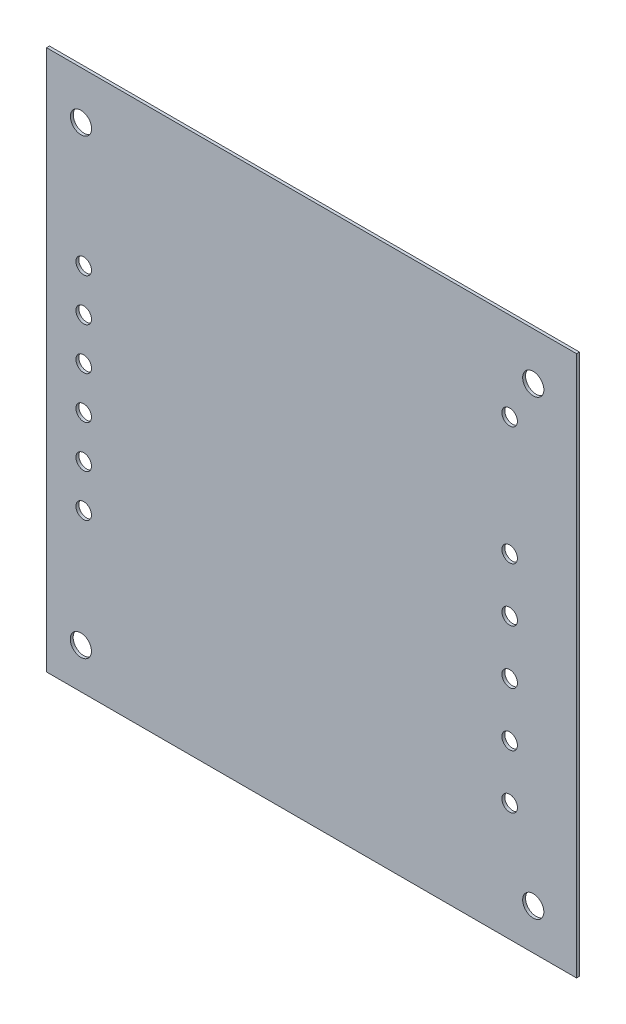
ISO-10303-21;
HEADER;
FILE_DESCRIPTION(('STEP AP214'),'2;1');
FILE_NAME('part.step','',(''),(''),'','','');
FILE_SCHEMA(('AUTOMOTIVE_DESIGN { 1 0 10303 214 1 1 1 1 }'));
ENDSEC;
DATA;
#1=APPLICATION_CONTEXT('core data for automotive mechanical design processes');
#2=APPLICATION_PROTOCOL_DEFINITION('international standard','automotive_design',2000,#1);
#3=PRODUCT_CONTEXT('',#1,'mechanical');
#4=PRODUCT('Part','Part','',(#3));
#5=PRODUCT_RELATED_PRODUCT_CATEGORY('part','',(#4));
#6=PRODUCT_DEFINITION_FORMATION('','',#4);
#7=PRODUCT_DEFINITION_CONTEXT('part definition',#1,'design');
#8=PRODUCT_DEFINITION('design','',#6,#7);
#9=PRODUCT_DEFINITION_SHAPE('','',#8);
#10=(LENGTH_UNIT() NAMED_UNIT(*) SI_UNIT(.MILLI.,.METRE.));
#11=(NAMED_UNIT(*) PLANE_ANGLE_UNIT() SI_UNIT($,.RADIAN.));
#12=(NAMED_UNIT(*) SI_UNIT($,.STERADIAN.) SOLID_ANGLE_UNIT());
#13=UNCERTAINTY_MEASURE_WITH_UNIT(LENGTH_MEASURE(1.E-05),#10,'distance_accuracy_value','');
#14=(GEOMETRIC_REPRESENTATION_CONTEXT(3) GLOBAL_UNCERTAINTY_ASSIGNED_CONTEXT((#13)) GLOBAL_UNIT_ASSIGNED_CONTEXT((#10,
#11,#12)) REPRESENTATION_CONTEXT('',''));
#15=CARTESIAN_POINT('',(0.,0.,0.));
#16=DIRECTION('',(0.,0.,1.));
#17=DIRECTION('',(1.,0.,0.));
#18=AXIS2_PLACEMENT_3D('',#15,#16,#17);
#19=CARTESIAN_POINT('',(37.62699945271,38.375001892447,0.));
#20=DIRECTION('',(0.,0.,-1.));
#21=DIRECTION('',(0.,-1.,0.));
#22=AXIS2_PLACEMENT_3D('',#19,#20,#21);
#23=PLANE('',#22);
#24=CARTESIAN_POINT('',(69.,69.892997741699,0.));
#25=DIRECTION('',(0.,0.,1.));
#26=DIRECTION('',(1.,0.,0.));
#27=AXIS2_PLACEMENT_3D('',#24,#25,#26);
#28=CIRCLE('',#27,1.5);
#29=CARTESIAN_POINT('',(70.5,69.892997741699,0.));
#30=VERTEX_POINT('',#29);
#31=EDGE_CURVE('E27',#30,#30,#28,.T.);
#32=ORIENTED_EDGE('',*,*,#31,.F.);
#33=EDGE_LOOP('',(#32));
#34=FACE_BOUND('',#33,.T.);
#35=CARTESIAN_POINT('',(65.663,64.143,0.));
#36=DIRECTION('',(0.,0.,1.));
#37=DIRECTION('',(1.,0.,0.));
#38=AXIS2_PLACEMENT_3D('',#35,#36,#37);
#39=CIRCLE('',#38,1.1);
#40=CARTESIAN_POINT('',(66.763,64.143,0.));
#41=VERTEX_POINT('',#40);
#42=EDGE_CURVE('E259',#41,#41,#39,.T.);
#43=ORIENTED_EDGE('',*,*,#42,.F.);
#44=EDGE_LOOP('',(#43));
#45=FACE_BOUND('',#44,.T.);
#46=CARTESIAN_POINT('',(65.663,47.36,0.));
#47=DIRECTION('',(0.,0.,1.));
#48=DIRECTION('',(1.,0.,0.));
#49=AXIS2_PLACEMENT_3D('',#46,#47,#48);
#50=CIRCLE('',#49,1.1);
#51=CARTESIAN_POINT('',(66.763,47.36,0.));
#52=VERTEX_POINT('',#51);
#53=EDGE_CURVE('E268',#52,#52,#50,.T.);
#54=ORIENTED_EDGE('',*,*,#53,.F.);
#55=EDGE_LOOP('',(#54));
#56=FACE_BOUND('',#55,.T.);
#57=CARTESIAN_POINT('',(65.663,39.722,0.));
#58=DIRECTION('',(0.,0.,1.));
#59=DIRECTION('',(1.,0.,0.));
#60=AXIS2_PLACEMENT_3D('',#57,#58,#59);
#61=CIRCLE('',#60,1.1);
#62=CARTESIAN_POINT('',(66.763,39.722,0.));
#63=VERTEX_POINT('',#62);
#64=EDGE_CURVE('E282',#63,#63,#61,.T.);
#65=ORIENTED_EDGE('',*,*,#64,.F.);
#66=EDGE_LOOP('',(#65));
#67=FACE_BOUND('',#66,.T.);
#68=CARTESIAN_POINT('',(65.663,16.808,0.));
#69=DIRECTION('',(0.,0.,1.));
#70=DIRECTION('',(1.,0.,0.));
#71=AXIS2_PLACEMENT_3D('',#68,#69,#70);
#72=CIRCLE('',#71,1.1);
#73=CARTESIAN_POINT('',(66.763,16.808,0.));
#74=VERTEX_POINT('',#73);
#75=EDGE_CURVE('E233',#74,#74,#72,.T.);
#76=ORIENTED_EDGE('',*,*,#75,.F.);
#77=EDGE_LOOP('',(#76));
#78=FACE_BOUND('',#77,.T.);
#79=CARTESIAN_POINT('',(69.,5.893000125885,0.));
#80=DIRECTION('',(0.,0.,1.));
#81=DIRECTION('',(1.,0.,0.));
#82=AXIS2_PLACEMENT_3D('',#79,#80,#81);
#83=CIRCLE('',#82,1.5);
#84=CARTESIAN_POINT('',(70.5,5.893000125885,0.));
#85=VERTEX_POINT('',#84);
#86=EDGE_CURVE('E273',#85,#85,#83,.T.);
#87=ORIENTED_EDGE('',*,*,#86,.F.);
#88=EDGE_LOOP('',(#87));
#89=FACE_BOUND('',#88,.T.);
#90=CARTESIAN_POINT('',(65.663,32.084,0.));
#91=DIRECTION('',(0.,0.,1.));
#92=DIRECTION('',(1.,0.,0.));
#93=AXIS2_PLACEMENT_3D('',#90,#91,#92);
#94=CIRCLE('',#93,1.1);
#95=CARTESIAN_POINT('',(66.763,32.084,0.));
#96=VERTEX_POINT('',#95);
#97=EDGE_CURVE('E214',#96,#96,#94,.T.);
#98=ORIENTED_EDGE('',*,*,#97,.F.);
#99=EDGE_LOOP('',(#98));
#100=FACE_BOUND('',#99,.T.);
#101=CARTESIAN_POINT('',(65.663,24.446,0.));
#102=DIRECTION('',(0.,0.,1.));
#103=DIRECTION('',(1.,0.,0.));
#104=AXIS2_PLACEMENT_3D('',#101,#102,#103);
#105=CIRCLE('',#104,1.1);
#106=CARTESIAN_POINT('',(66.763,24.446,0.));
#107=VERTEX_POINT('',#106);
#108=EDGE_CURVE('E390',#107,#107,#105,.T.);
#109=ORIENTED_EDGE('',*,*,#108,.F.);
#110=EDGE_LOOP('',(#109));
#111=FACE_BOUND('',#110,.T.);
#112=CARTESIAN_POINT('',(5.,69.892997741699,0.));
#113=DIRECTION('',(0.,0.,1.));
#114=DIRECTION('',(1.,0.,0.));
#115=AXIS2_PLACEMENT_3D('',#112,#113,#114);
#116=CIRCLE('',#115,1.5);
#117=CARTESIAN_POINT('',(6.5,69.892997741699,0.));
#118=VERTEX_POINT('',#117);
#119=EDGE_CURVE('E207',#118,#118,#116,.T.);
#120=ORIENTED_EDGE('',*,*,#119,.F.);
#121=EDGE_LOOP('',(#120));
#122=FACE_BOUND('',#121,.T.);
#123=CARTESIAN_POINT('',(5.385,52.524,0.));
#124=DIRECTION('',(0.,0.,1.));
#125=DIRECTION('',(1.,0.,0.));
#126=AXIS2_PLACEMENT_3D('',#123,#124,#125);
#127=CIRCLE('',#126,1.1);
#128=CARTESIAN_POINT('',(6.485,52.524,0.));
#129=VERTEX_POINT('',#128);
#130=EDGE_CURVE('E199',#129,#129,#127,.T.);
#131=ORIENTED_EDGE('',*,*,#130,.F.);
#132=EDGE_LOOP('',(#131));
#133=FACE_BOUND('',#132,.T.);
#134=CARTESIAN_POINT('',(5.385,46.524,0.));
#135=DIRECTION('',(0.,0.,1.));
#136=DIRECTION('',(1.,0.,0.));
#137=AXIS2_PLACEMENT_3D('',#134,#135,#136);
#138=CIRCLE('',#137,1.1);
#139=CARTESIAN_POINT('',(6.485,46.524,0.));
#140=VERTEX_POINT('',#139);
#141=EDGE_CURVE('E261',#140,#140,#138,.T.);
#142=ORIENTED_EDGE('',*,*,#141,.F.);
#143=EDGE_LOOP('',(#142));
#144=FACE_BOUND('',#143,.T.);
#145=CARTESIAN_POINT('',(5.385,40.524,0.));
#146=DIRECTION('',(0.,0.,1.));
#147=DIRECTION('',(1.,0.,0.));
#148=AXIS2_PLACEMENT_3D('',#145,#146,#147);
#149=CIRCLE('',#148,1.1);
#150=CARTESIAN_POINT('',(6.485,40.524,0.));
#151=VERTEX_POINT('',#150);
#152=EDGE_CURVE('E315',#151,#151,#149,.T.);
#153=ORIENTED_EDGE('',*,*,#152,.F.);
#154=EDGE_LOOP('',(#153));
#155=FACE_BOUND('',#154,.T.);
#156=CARTESIAN_POINT('',(5.385,34.524,0.));
#157=DIRECTION('',(0.,0.,1.));
#158=DIRECTION('',(1.,0.,0.));
#159=AXIS2_PLACEMENT_3D('',#156,#157,#158);
#160=CIRCLE('',#159,1.1);
#161=CARTESIAN_POINT('',(6.485,34.524,0.));
#162=VERTEX_POINT('',#161);
#163=EDGE_CURVE('E244',#162,#162,#160,.T.);
#164=ORIENTED_EDGE('',*,*,#163,.F.);
#165=EDGE_LOOP('',(#164));
#166=FACE_BOUND('',#165,.T.);
#167=CARTESIAN_POINT('',(5.385,28.524,0.));
#168=DIRECTION('',(0.,0.,1.));
#169=DIRECTION('',(1.,0.,0.));
#170=AXIS2_PLACEMENT_3D('',#167,#168,#169);
#171=CIRCLE('',#170,1.1);
#172=CARTESIAN_POINT('',(6.485,28.524,0.));
#173=VERTEX_POINT('',#172);
#174=EDGE_CURVE('E290',#173,#173,#171,.T.);
#175=ORIENTED_EDGE('',*,*,#174,.F.);
#176=EDGE_LOOP('',(#175));
#177=FACE_BOUND('',#176,.T.);
#178=CARTESIAN_POINT('',(5.385,22.524,0.));
#179=DIRECTION('',(0.,0.,1.));
#180=DIRECTION('',(1.,0.,0.));
#181=AXIS2_PLACEMENT_3D('',#178,#179,#180);
#182=CIRCLE('',#181,1.1);
#183=CARTESIAN_POINT('',(6.485,22.524,0.));
#184=VERTEX_POINT('',#183);
#185=EDGE_CURVE('E223',#184,#184,#182,.T.);
#186=ORIENTED_EDGE('',*,*,#185,.F.);
#187=EDGE_LOOP('',(#186));
#188=FACE_BOUND('',#187,.T.);
#189=CARTESIAN_POINT('',(4.980000019073,5.842000007629,0.));
#190=DIRECTION('',(0.,0.,1.));
#191=DIRECTION('',(1.,0.,0.));
#192=AXIS2_PLACEMENT_3D('',#189,#190,#191);
#193=CIRCLE('',#192,1.5);
#194=CARTESIAN_POINT('',(6.480000019073,5.842000007629,0.));
#195=VERTEX_POINT('',#194);
#196=EDGE_CURVE('E323',#195,#195,#193,.T.);
#197=ORIENTED_EDGE('',*,*,#196,.F.);
#198=EDGE_LOOP('',(#197));
#199=FACE_BOUND('',#198,.T.);
#200=DIRECTION('',(-1.,0.,0.));
#201=VECTOR('',#200,1.);
#202=CARTESIAN_POINT('',(75.126998901367,0.118000000715,0.));
#203=LINE('',#202,#201);
#204=CARTESIAN_POINT('',(75.126998901367,0.118000000715,0.));
#205=VERTEX_POINT('',#204);
#206=CARTESIAN_POINT('',(0.127000004053,0.118000000715,0.));
#207=VERTEX_POINT('',#206);
#208=EDGE_CURVE('E328',#205,#207,#203,.T.);
#209=ORIENTED_EDGE('',*,*,#208,.F.);
#210=DIRECTION('',(0.,-1.,0.));
#211=VECTOR('',#210,1.);
#212=CARTESIAN_POINT('',(75.126998901367,76.63200378418,0.));
#213=LINE('',#212,#211);
#214=CARTESIAN_POINT('',(75.126998901367,76.63200378418,0.));
#215=VERTEX_POINT('',#214);
#216=EDGE_CURVE('E253',#215,#205,#213,.T.);
#217=ORIENTED_EDGE('',*,*,#216,.F.);
#218=DIRECTION('',(1.,0.,0.));
#219=VECTOR('',#218,1.);
#220=CARTESIAN_POINT('',(0.127000004053,76.63200378418,0.));
#221=LINE('',#220,#219);
#222=CARTESIAN_POINT('',(0.127000004053,76.63200378418,0.));
#223=VERTEX_POINT('',#222);
#224=EDGE_CURVE('E304',#223,#215,#221,.T.);
#225=ORIENTED_EDGE('',*,*,#224,.F.);
#226=DIRECTION('',(0.,1.,0.));
#227=VECTOR('',#226,1.);
#228=CARTESIAN_POINT('',(0.127000004053,0.118000000715,0.));
#229=LINE('',#228,#227);
#230=EDGE_CURVE('E243',#207,#223,#229,.T.);
#231=ORIENTED_EDGE('',*,*,#230,.F.);
#232=EDGE_LOOP('',(#209,#217,#225,#231));
#233=FACE_BOUND('',#232,.T.);
#234=ADVANCED_FACE('F16',(#34,#45,#56,#67,#78,#89,#100,#111,#122,#133,#144,#155,#166,#177,#188,
#199,#233),#23,.F.);
#235=CARTESIAN_POINT('',(37.62699945271,38.375001892447,-0.41148));
#236=DIRECTION('',(0.,0.,-1.));
#237=DIRECTION('',(0.,-1.,0.));
#238=AXIS2_PLACEMENT_3D('',#235,#236,#237);
#239=PLANE('',#238);
#240=CARTESIAN_POINT('',(69.,69.892997741699,-0.41148));
#241=DIRECTION('',(0.,0.,1.));
#242=DIRECTION('',(1.,0.,0.));
#243=AXIS2_PLACEMENT_3D('',#240,#241,#242);
#244=CIRCLE('',#243,1.5);
#245=CARTESIAN_POINT('',(70.5,69.892997741699,-0.41148));
#246=VERTEX_POINT('',#245);
#247=EDGE_CURVE('E10',#246,#246,#244,.T.);
#248=ORIENTED_EDGE('',*,*,#247,.T.);
#249=EDGE_LOOP('',(#248));
#250=FACE_BOUND('',#249,.T.);
#251=CARTESIAN_POINT('',(65.663,64.143,-0.41148));
#252=DIRECTION('',(0.,0.,1.));
#253=DIRECTION('',(1.,0.,0.));
#254=AXIS2_PLACEMENT_3D('',#251,#252,#253);
#255=CIRCLE('',#254,1.1);
#256=CARTESIAN_POINT('',(66.763,64.143,-0.41148));
#257=VERTEX_POINT('',#256);
#258=EDGE_CURVE('E228',#257,#257,#255,.T.);
#259=ORIENTED_EDGE('',*,*,#258,.T.);
#260=EDGE_LOOP('',(#259));
#261=FACE_BOUND('',#260,.T.);
#262=CARTESIAN_POINT('',(65.663,47.36,-0.41148));
#263=DIRECTION('',(0.,0.,1.));
#264=DIRECTION('',(1.,0.,0.));
#265=AXIS2_PLACEMENT_3D('',#262,#263,#264);
#266=CIRCLE('',#265,1.1);
#267=CARTESIAN_POINT('',(66.763,47.36,-0.41148));
#268=VERTEX_POINT('',#267);
#269=EDGE_CURVE('E260',#268,#268,#266,.T.);
#270=ORIENTED_EDGE('',*,*,#269,.T.);
#271=EDGE_LOOP('',(#270));
#272=FACE_BOUND('',#271,.T.);
#273=CARTESIAN_POINT('',(65.663,39.722,-0.41148));
#274=DIRECTION('',(0.,0.,1.));
#275=DIRECTION('',(1.,0.,0.));
#276=AXIS2_PLACEMENT_3D('',#273,#274,#275);
#277=CIRCLE('',#276,1.1);
#278=CARTESIAN_POINT('',(66.763,39.722,-0.41148));
#279=VERTEX_POINT('',#278);
#280=EDGE_CURVE('E298',#279,#279,#277,.T.);
#281=ORIENTED_EDGE('',*,*,#280,.T.);
#282=EDGE_LOOP('',(#281));
#283=FACE_BOUND('',#282,.T.);
#284=CARTESIAN_POINT('',(65.663,16.808,-0.41148));
#285=DIRECTION('',(0.,0.,1.));
#286=DIRECTION('',(1.,0.,0.));
#287=AXIS2_PLACEMENT_3D('',#284,#285,#286);
#288=CIRCLE('',#287,1.1);
#289=CARTESIAN_POINT('',(66.763,16.808,-0.41148));
#290=VERTEX_POINT('',#289);
#291=EDGE_CURVE('E236',#290,#290,#288,.T.);
#292=ORIENTED_EDGE('',*,*,#291,.T.);
#293=EDGE_LOOP('',(#292));
#294=FACE_BOUND('',#293,.T.);
#295=CARTESIAN_POINT('',(69.,5.893000125885,-0.41148));
#296=DIRECTION('',(0.,0.,1.));
#297=DIRECTION('',(1.,0.,0.));
#298=AXIS2_PLACEMENT_3D('',#295,#296,#297);
#299=CIRCLE('',#298,1.5);
#300=CARTESIAN_POINT('',(70.5,5.893000125885,-0.41148));
#301=VERTEX_POINT('',#300);
#302=EDGE_CURVE('E276',#301,#301,#299,.T.);
#303=ORIENTED_EDGE('',*,*,#302,.T.);
#304=EDGE_LOOP('',(#303));
#305=FACE_BOUND('',#304,.T.);
#306=CARTESIAN_POINT('',(65.663,32.084,-0.41148));
#307=DIRECTION('',(0.,0.,1.));
#308=DIRECTION('',(1.,0.,0.));
#309=AXIS2_PLACEMENT_3D('',#306,#307,#308);
#310=CIRCLE('',#309,1.1);
#311=CARTESIAN_POINT('',(66.763,32.084,-0.41148));
#312=VERTEX_POINT('',#311);
#313=EDGE_CURVE('E217',#312,#312,#310,.T.);
#314=ORIENTED_EDGE('',*,*,#313,.T.);
#315=EDGE_LOOP('',(#314));
#316=FACE_BOUND('',#315,.T.);
#317=CARTESIAN_POINT('',(65.663,24.446,-0.41148));
#318=DIRECTION('',(0.,0.,1.));
#319=DIRECTION('',(1.,0.,0.));
#320=AXIS2_PLACEMENT_3D('',#317,#318,#319);
#321=CIRCLE('',#320,1.1);
#322=CARTESIAN_POINT('',(66.763,24.446,-0.41148));
#323=VERTEX_POINT('',#322);
#324=EDGE_CURVE('E232',#323,#323,#321,.T.);
#325=ORIENTED_EDGE('',*,*,#324,.T.);
#326=EDGE_LOOP('',(#325));
#327=FACE_BOUND('',#326,.T.);
#328=CARTESIAN_POINT('',(5.,69.892997741699,-0.41148));
#329=DIRECTION('',(0.,0.,1.));
#330=DIRECTION('',(1.,0.,0.));
#331=AXIS2_PLACEMENT_3D('',#328,#329,#330);
#332=CIRCLE('',#331,1.5);
#333=CARTESIAN_POINT('',(6.5,69.892997741699,-0.41148));
#334=VERTEX_POINT('',#333);
#335=EDGE_CURVE('E285',#334,#334,#332,.T.);
#336=ORIENTED_EDGE('',*,*,#335,.T.);
#337=EDGE_LOOP('',(#336));
#338=FACE_BOUND('',#337,.T.);
#339=CARTESIAN_POINT('',(5.385,52.524,-0.41148));
#340=DIRECTION('',(0.,0.,1.));
#341=DIRECTION('',(1.,0.,0.));
#342=AXIS2_PLACEMENT_3D('',#339,#340,#341);
#343=CIRCLE('',#342,1.1);
#344=CARTESIAN_POINT('',(6.485,52.524,-0.41148));
#345=VERTEX_POINT('',#344);
#346=EDGE_CURVE('E191',#345,#345,#343,.T.);
#347=ORIENTED_EDGE('',*,*,#346,.T.);
#348=EDGE_LOOP('',(#347));
#349=FACE_BOUND('',#348,.T.);
#350=CARTESIAN_POINT('',(5.385,46.524,-0.41148));
#351=DIRECTION('',(0.,0.,1.));
#352=DIRECTION('',(1.,0.,0.));
#353=AXIS2_PLACEMENT_3D('',#350,#351,#352);
#354=CIRCLE('',#353,1.1);
#355=CARTESIAN_POINT('',(6.485,46.524,-0.41148));
#356=VERTEX_POINT('',#355);
#357=EDGE_CURVE('E264',#356,#356,#354,.T.);
#358=ORIENTED_EDGE('',*,*,#357,.T.);
#359=EDGE_LOOP('',(#358));
#360=FACE_BOUND('',#359,.T.);
#361=CARTESIAN_POINT('',(5.385,40.524,-0.41148));
#362=DIRECTION('',(0.,0.,1.));
#363=DIRECTION('',(1.,0.,0.));
#364=AXIS2_PLACEMENT_3D('',#361,#362,#363);
#365=CIRCLE('',#364,1.1);
#366=CARTESIAN_POINT('',(6.485,40.524,-0.41148));
#367=VERTEX_POINT('',#366);
#368=EDGE_CURVE('E312',#367,#367,#365,.T.);
#369=ORIENTED_EDGE('',*,*,#368,.T.);
#370=EDGE_LOOP('',(#369));
#371=FACE_BOUND('',#370,.T.);
#372=CARTESIAN_POINT('',(5.385,34.524,-0.41148));
#373=DIRECTION('',(0.,0.,1.));
#374=DIRECTION('',(1.,0.,0.));
#375=AXIS2_PLACEMENT_3D('',#372,#373,#374);
#376=CIRCLE('',#375,1.1);
#377=CARTESIAN_POINT('',(6.485,34.524,-0.41148));
#378=VERTEX_POINT('',#377);
#379=EDGE_CURVE('E247',#378,#378,#376,.T.);
#380=ORIENTED_EDGE('',*,*,#379,.T.);
#381=EDGE_LOOP('',(#380));
#382=FACE_BOUND('',#381,.T.);
#383=CARTESIAN_POINT('',(5.385,28.524,-0.41148));
#384=DIRECTION('',(0.,0.,1.));
#385=DIRECTION('',(1.,0.,0.));
#386=AXIS2_PLACEMENT_3D('',#383,#384,#385);
#387=CIRCLE('',#386,1.1);
#388=CARTESIAN_POINT('',(6.485,28.524,-0.41148));
#389=VERTEX_POINT('',#388);
#390=EDGE_CURVE('E293',#389,#389,#387,.T.);
#391=ORIENTED_EDGE('',*,*,#390,.T.);
#392=EDGE_LOOP('',(#391));
#393=FACE_BOUND('',#392,.T.);
#394=CARTESIAN_POINT('',(5.385,22.524,-0.41148));
#395=DIRECTION('',(0.,0.,1.));
#396=DIRECTION('',(1.,0.,0.));
#397=AXIS2_PLACEMENT_3D('',#394,#395,#396);
#398=CIRCLE('',#397,1.1);
#399=CARTESIAN_POINT('',(6.485,22.524,-0.41148));
#400=VERTEX_POINT('',#399);
#401=EDGE_CURVE('E311',#400,#400,#398,.T.);
#402=ORIENTED_EDGE('',*,*,#401,.T.);
#403=EDGE_LOOP('',(#402));
#404=FACE_BOUND('',#403,.T.);
#405=CARTESIAN_POINT('',(4.980000019073,5.842000007629,-0.41148));
#406=DIRECTION('',(0.,0.,1.));
#407=DIRECTION('',(1.,0.,0.));
#408=AXIS2_PLACEMENT_3D('',#405,#406,#407);
#409=CIRCLE('',#408,1.5);
#410=CARTESIAN_POINT('',(6.480000019073,5.842000007629,-0.41148));
#411=VERTEX_POINT('',#410);
#412=EDGE_CURVE('E224',#411,#411,#409,.T.);
#413=ORIENTED_EDGE('',*,*,#412,.T.);
#414=EDGE_LOOP('',(#413));
#415=FACE_BOUND('',#414,.T.);
#416=DIRECTION('',(0.,1.,0.));
#417=VECTOR('',#416,1.);
#418=CARTESIAN_POINT('',(0.127000004053,0.118000000715,-0.41148));
#419=LINE('',#418,#417);
#420=CARTESIAN_POINT('',(0.127000004053,0.118000000715,-0.41148));
#421=VERTEX_POINT('',#420);
#422=CARTESIAN_POINT('',(0.127000004053,76.63200378418,-0.41148));
#423=VERTEX_POINT('',#422);
#424=EDGE_CURVE('E242',#421,#423,#419,.T.);
#425=ORIENTED_EDGE('',*,*,#424,.T.);
#426=DIRECTION('',(1.,0.,0.));
#427=VECTOR('',#426,1.);
#428=CARTESIAN_POINT('',(0.127000004053,76.63200378418,-0.41148));
#429=LINE('',#428,#427);
#430=CARTESIAN_POINT('',(75.126998901367,76.63200378418,-0.41148));
#431=VERTEX_POINT('',#430);
#432=EDGE_CURVE('E249',#423,#431,#429,.T.);
#433=ORIENTED_EDGE('',*,*,#432,.T.);
#434=DIRECTION('',(0.,-1.,0.));
#435=VECTOR('',#434,1.);
#436=CARTESIAN_POINT('',(75.126998901367,76.63200378418,-0.41148));
#437=LINE('',#436,#435);
#438=CARTESIAN_POINT('',(75.126998901367,0.118000000715,-0.41148));
#439=VERTEX_POINT('',#438);
#440=EDGE_CURVE('E289',#431,#439,#437,.T.);
#441=ORIENTED_EDGE('',*,*,#440,.T.);
#442=DIRECTION('',(-1.,0.,0.));
#443=VECTOR('',#442,1.);
#444=CARTESIAN_POINT('',(75.126998901367,0.118000000715,-0.41148));
#445=LINE('',#444,#443);
#446=EDGE_CURVE('E332',#439,#421,#445,.T.);
#447=ORIENTED_EDGE('',*,*,#446,.T.);
#448=EDGE_LOOP('',(#425,#433,#441,#447));
#449=FACE_BOUND('',#448,.T.);
#450=ADVANCED_FACE('F192',(#250,#261,#272,#283,#294,#305,#316,#327,#338,#349,#360,#371,#382,
#393,#404,#415,#449),#239,.T.);
#451=CARTESIAN_POINT('',(69.,69.892997741699,-0.41148));
#452=DIRECTION('',(0.,0.,-1.));
#453=DIRECTION('',(1.,0.,0.));
#454=AXIS2_PLACEMENT_3D('',#451,#452,#453);
#455=CYLINDRICAL_SURFACE('',#454,1.5);
#456=DIRECTION('',(0.,0.,1.));
#457=VECTOR('',#456,1.);
#458=CARTESIAN_POINT('',(70.5,69.892997741699,-0.41148));
#459=LINE('',#458,#457);
#460=EDGE_CURVE('E225',#246,#30,#459,.T.);
#461=ORIENTED_EDGE('',*,*,#460,.T.);
#462=ORIENTED_EDGE('',*,*,#31,.T.);
#463=ORIENTED_EDGE('',*,*,#460,.F.);
#464=ORIENTED_EDGE('',*,*,#247,.F.);
#465=EDGE_LOOP('',(#461,#462,#463,#464));
#466=FACE_BOUND('',#465,.T.);
#467=ADVANCED_FACE('F430',(#466),#455,.F.);
#468=CARTESIAN_POINT('',(65.663,64.143,-0.41148));
#469=DIRECTION('',(0.,0.,-1.));
#470=DIRECTION('',(1.,0.,0.));
#471=AXIS2_PLACEMENT_3D('',#468,#469,#470);
#472=CYLINDRICAL_SURFACE('',#471,1.1);
#473=DIRECTION('',(0.,0.,1.));
#474=VECTOR('',#473,1.);
#475=CARTESIAN_POINT('',(66.763,64.143,-0.41148));
#476=LINE('',#475,#474);
#477=EDGE_CURVE('E255',#257,#41,#476,.T.);
#478=ORIENTED_EDGE('',*,*,#477,.T.);
#479=ORIENTED_EDGE('',*,*,#42,.T.);
#480=ORIENTED_EDGE('',*,*,#477,.F.);
#481=ORIENTED_EDGE('',*,*,#258,.F.);
#482=EDGE_LOOP('',(#478,#479,#480,#481));
#483=FACE_BOUND('',#482,.T.);
#484=ADVANCED_FACE('F18',(#483),#472,.F.);
#485=CARTESIAN_POINT('',(65.663,47.36,-0.41148));
#486=DIRECTION('',(0.,0.,-1.));
#487=DIRECTION('',(1.,0.,0.));
#488=AXIS2_PLACEMENT_3D('',#485,#486,#487);
#489=CYLINDRICAL_SURFACE('',#488,1.1);
#490=DIRECTION('',(0.,0.,1.));
#491=VECTOR('',#490,1.);
#492=CARTESIAN_POINT('',(66.763,47.36,-0.41148));
#493=LINE('',#492,#491);
#494=EDGE_CURVE('E301',#268,#52,#493,.T.);
#495=ORIENTED_EDGE('',*,*,#494,.T.);
#496=ORIENTED_EDGE('',*,*,#53,.T.);
#497=ORIENTED_EDGE('',*,*,#494,.F.);
#498=ORIENTED_EDGE('',*,*,#269,.F.);
#499=EDGE_LOOP('',(#495,#496,#497,#498));
#500=FACE_BOUND('',#499,.T.);
#501=ADVANCED_FACE('F429',(#500),#489,.F.);
#502=CARTESIAN_POINT('',(65.663,39.722,-0.41148));
#503=DIRECTION('',(0.,0.,-1.));
#504=DIRECTION('',(1.,0.,0.));
#505=AXIS2_PLACEMENT_3D('',#502,#503,#504);
#506=CYLINDRICAL_SURFACE('',#505,1.1);
#507=DIRECTION('',(0.,0.,1.));
#508=VECTOR('',#507,1.);
#509=CARTESIAN_POINT('',(66.763,39.722,-0.41148));
#510=LINE('',#509,#508);
#511=EDGE_CURVE('E278',#279,#63,#510,.T.);
#512=ORIENTED_EDGE('',*,*,#511,.T.);
#513=ORIENTED_EDGE('',*,*,#64,.T.);
#514=ORIENTED_EDGE('',*,*,#511,.F.);
#515=ORIENTED_EDGE('',*,*,#280,.F.);
#516=EDGE_LOOP('',(#512,#513,#514,#515));
#517=FACE_BOUND('',#516,.T.);
#518=ADVANCED_FACE('F442',(#517),#506,.F.);
#519=CARTESIAN_POINT('',(65.663,16.808,-0.41148));
#520=DIRECTION('',(0.,0.,-1.));
#521=DIRECTION('',(1.,0.,0.));
#522=AXIS2_PLACEMENT_3D('',#519,#520,#521);
#523=CYLINDRICAL_SURFACE('',#522,1.1);
#524=DIRECTION('',(0.,0.,1.));
#525=VECTOR('',#524,1.);
#526=CARTESIAN_POINT('',(66.763,16.808,-0.41148));
#527=LINE('',#526,#525);
#528=EDGE_CURVE('E237',#290,#74,#527,.T.);
#529=ORIENTED_EDGE('',*,*,#528,.T.);
#530=ORIENTED_EDGE('',*,*,#75,.T.);
#531=ORIENTED_EDGE('',*,*,#528,.F.);
#532=ORIENTED_EDGE('',*,*,#291,.F.);
#533=EDGE_LOOP('',(#529,#530,#531,#532));
#534=FACE_BOUND('',#533,.T.);
#535=ADVANCED_FACE('F353',(#534),#523,.F.);
#536=CARTESIAN_POINT('',(69.,5.893000125885,-0.41148));
#537=DIRECTION('',(0.,0.,-1.));
#538=DIRECTION('',(1.,0.,0.));
#539=AXIS2_PLACEMENT_3D('',#536,#537,#538);
#540=CYLINDRICAL_SURFACE('',#539,1.5);
#541=DIRECTION('',(0.,0.,1.));
#542=VECTOR('',#541,1.);
#543=CARTESIAN_POINT('',(70.5,5.893000125885,-0.41148));
#544=LINE('',#543,#542);
#545=EDGE_CURVE('E277',#301,#85,#544,.T.);
#546=ORIENTED_EDGE('',*,*,#545,.T.);
#547=ORIENTED_EDGE('',*,*,#86,.T.);
#548=ORIENTED_EDGE('',*,*,#545,.F.);
#549=ORIENTED_EDGE('',*,*,#302,.F.);
#550=EDGE_LOOP('',(#546,#547,#548,#549));
#551=FACE_BOUND('',#550,.T.);
#552=ADVANCED_FACE('F449',(#551),#540,.F.);
#553=CARTESIAN_POINT('',(65.663,32.084,-0.41148));
#554=DIRECTION('',(0.,0.,-1.));
#555=DIRECTION('',(1.,0.,0.));
#556=AXIS2_PLACEMENT_3D('',#553,#554,#555);
#557=CYLINDRICAL_SURFACE('',#556,1.1);
#558=DIRECTION('',(0.,0.,1.));
#559=VECTOR('',#558,1.);
#560=CARTESIAN_POINT('',(66.763,32.084,-0.41148));
#561=LINE('',#560,#559);
#562=EDGE_CURVE('E218',#312,#96,#561,.T.);
#563=ORIENTED_EDGE('',*,*,#562,.T.);
#564=ORIENTED_EDGE('',*,*,#97,.T.);
#565=ORIENTED_EDGE('',*,*,#562,.F.);
#566=ORIENTED_EDGE('',*,*,#313,.F.);
#567=EDGE_LOOP('',(#563,#564,#565,#566));
#568=FACE_BOUND('',#567,.T.);
#569=ADVANCED_FACE('F454',(#568),#557,.F.);
#570=CARTESIAN_POINT('',(65.663,24.446,-0.41148));
#571=DIRECTION('',(0.,0.,-1.));
#572=DIRECTION('',(1.,0.,0.));
#573=AXIS2_PLACEMENT_3D('',#570,#571,#572);
#574=CYLINDRICAL_SURFACE('',#573,1.1);
#575=DIRECTION('',(0.,0.,1.));
#576=VECTOR('',#575,1.);
#577=CARTESIAN_POINT('',(66.763,24.446,-0.41148));
#578=LINE('',#577,#576);
#579=EDGE_CURVE('E372',#323,#107,#578,.T.);
#580=ORIENTED_EDGE('',*,*,#579,.T.);
#581=ORIENTED_EDGE('',*,*,#108,.T.);
#582=ORIENTED_EDGE('',*,*,#579,.F.);
#583=ORIENTED_EDGE('',*,*,#324,.F.);
#584=EDGE_LOOP('',(#580,#581,#582,#583));
#585=FACE_BOUND('',#584,.T.);
#586=ADVANCED_FACE('F543',(#585),#574,.F.);
#587=CARTESIAN_POINT('',(5.,69.892997741699,-0.41148));
#588=DIRECTION('',(0.,0.,-1.));
#589=DIRECTION('',(1.,0.,0.));
#590=AXIS2_PLACEMENT_3D('',#587,#588,#589);
#591=CYLINDRICAL_SURFACE('',#590,1.5);
#592=DIRECTION('',(0.,0.,1.));
#593=VECTOR('',#592,1.);
#594=CARTESIAN_POINT('',(6.5,69.892997741699,-0.41148));
#595=LINE('',#594,#593);
#596=EDGE_CURVE('E198',#334,#118,#595,.T.);
#597=ORIENTED_EDGE('',*,*,#596,.T.);
#598=ORIENTED_EDGE('',*,*,#119,.T.);
#599=ORIENTED_EDGE('',*,*,#596,.F.);
#600=ORIENTED_EDGE('',*,*,#335,.F.);
#601=EDGE_LOOP('',(#597,#598,#599,#600));
#602=FACE_BOUND('',#601,.T.);
#603=ADVANCED_FACE('F513',(#602),#591,.F.);
#604=CARTESIAN_POINT('',(5.385,52.524,-0.41148));
#605=DIRECTION('',(0.,0.,-1.));
#606=DIRECTION('',(1.,0.,0.));
#607=AXIS2_PLACEMENT_3D('',#604,#605,#606);
#608=CYLINDRICAL_SURFACE('',#607,1.1);
#609=DIRECTION('',(0.,0.,1.));
#610=VECTOR('',#609,1.);
#611=CARTESIAN_POINT('',(6.485,52.524,-0.41148));
#612=LINE('',#611,#610);
#613=EDGE_CURVE('E209',#345,#129,#612,.T.);
#614=ORIENTED_EDGE('',*,*,#613,.T.);
#615=ORIENTED_EDGE('',*,*,#130,.T.);
#616=ORIENTED_EDGE('',*,*,#613,.F.);
#617=ORIENTED_EDGE('',*,*,#346,.F.);
#618=EDGE_LOOP('',(#614,#615,#616,#617));
#619=FACE_BOUND('',#618,.T.);
#620=ADVANCED_FACE('F507',(#619),#608,.F.);
#621=CARTESIAN_POINT('',(5.385,46.524,-0.41148));
#622=DIRECTION('',(0.,0.,-1.));
#623=DIRECTION('',(1.,0.,0.));
#624=AXIS2_PLACEMENT_3D('',#621,#622,#623);
#625=CYLINDRICAL_SURFACE('',#624,1.1);
#626=DIRECTION('',(0.,0.,1.));
#627=VECTOR('',#626,1.);
#628=CARTESIAN_POINT('',(6.485,46.524,-0.41148));
#629=LINE('',#628,#627);
#630=EDGE_CURVE('E265',#356,#140,#629,.T.);
#631=ORIENTED_EDGE('',*,*,#630,.T.);
#632=ORIENTED_EDGE('',*,*,#141,.T.);
#633=ORIENTED_EDGE('',*,*,#630,.F.);
#634=ORIENTED_EDGE('',*,*,#357,.F.);
#635=EDGE_LOOP('',(#631,#632,#633,#634));
#636=FACE_BOUND('',#635,.T.);
#637=ADVANCED_FACE('F512',(#636),#625,.F.);
#638=CARTESIAN_POINT('',(5.385,40.524,-0.41148));
#639=DIRECTION('',(0.,0.,-1.));
#640=DIRECTION('',(1.,0.,0.));
#641=AXIS2_PLACEMENT_3D('',#638,#639,#640);
#642=CYLINDRICAL_SURFACE('',#641,1.1);
#643=DIRECTION('',(0.,0.,1.));
#644=VECTOR('',#643,1.);
#645=CARTESIAN_POINT('',(6.485,40.524,-0.41148));
#646=LINE('',#645,#644);
#647=EDGE_CURVE('E20',#367,#151,#646,.T.);
#648=ORIENTED_EDGE('',*,*,#647,.T.);
#649=ORIENTED_EDGE('',*,*,#152,.T.);
#650=ORIENTED_EDGE('',*,*,#647,.F.);
#651=ORIENTED_EDGE('',*,*,#368,.F.);
#652=EDGE_LOOP('',(#648,#649,#650,#651));
#653=FACE_BOUND('',#652,.T.);
#654=ADVANCED_FACE('F560',(#653),#642,.F.);
#655=CARTESIAN_POINT('',(5.385,34.524,-0.41148));
#656=DIRECTION('',(0.,0.,-1.));
#657=DIRECTION('',(1.,0.,0.));
#658=AXIS2_PLACEMENT_3D('',#655,#656,#657);
#659=CYLINDRICAL_SURFACE('',#658,1.1);
#660=DIRECTION('',(0.,0.,1.));
#661=VECTOR('',#660,1.);
#662=CARTESIAN_POINT('',(6.485,34.524,-0.41148));
#663=LINE('',#662,#661);
#664=EDGE_CURVE('E248',#378,#162,#663,.T.);
#665=ORIENTED_EDGE('',*,*,#664,.T.);
#666=ORIENTED_EDGE('',*,*,#163,.T.);
#667=ORIENTED_EDGE('',*,*,#664,.F.);
#668=ORIENTED_EDGE('',*,*,#379,.F.);
#669=EDGE_LOOP('',(#665,#666,#667,#668));
#670=FACE_BOUND('',#669,.T.);
#671=ADVANCED_FACE('F477',(#670),#659,.F.);
#672=CARTESIAN_POINT('',(5.385,28.524,-0.41148));
#673=DIRECTION('',(0.,0.,-1.));
#674=DIRECTION('',(1.,0.,0.));
#675=AXIS2_PLACEMENT_3D('',#672,#673,#674);
#676=CYLINDRICAL_SURFACE('',#675,1.1);
#677=DIRECTION('',(0.,0.,1.));
#678=VECTOR('',#677,1.);
#679=CARTESIAN_POINT('',(6.485,28.524,-0.41148));
#680=LINE('',#679,#678);
#681=EDGE_CURVE('E294',#389,#173,#680,.T.);
#682=ORIENTED_EDGE('',*,*,#681,.T.);
#683=ORIENTED_EDGE('',*,*,#174,.T.);
#684=ORIENTED_EDGE('',*,*,#681,.F.);
#685=ORIENTED_EDGE('',*,*,#390,.F.);
#686=EDGE_LOOP('',(#682,#683,#684,#685));
#687=FACE_BOUND('',#686,.T.);
#688=ADVANCED_FACE('F471',(#687),#676,.F.);
#689=CARTESIAN_POINT('',(5.385,22.524,-0.41148));
#690=DIRECTION('',(0.,0.,-1.));
#691=DIRECTION('',(1.,0.,0.));
#692=AXIS2_PLACEMENT_3D('',#689,#690,#691);
#693=CYLINDRICAL_SURFACE('',#692,1.1);
#694=DIRECTION('',(0.,0.,1.));
#695=VECTOR('',#694,1.);
#696=CARTESIAN_POINT('',(6.485,22.524,-0.41148));
#697=LINE('',#696,#695);
#698=EDGE_CURVE('E219',#400,#184,#697,.T.);
#699=ORIENTED_EDGE('',*,*,#698,.T.);
#700=ORIENTED_EDGE('',*,*,#185,.T.);
#701=ORIENTED_EDGE('',*,*,#698,.F.);
#702=ORIENTED_EDGE('',*,*,#401,.F.);
#703=EDGE_LOOP('',(#699,#700,#701,#702));
#704=FACE_BOUND('',#703,.T.);
#705=ADVANCED_FACE('F476',(#704),#693,.F.);
#706=CARTESIAN_POINT('',(4.980000019073,5.842000007629,-0.41148));
#707=DIRECTION('',(0.,0.,-1.));
#708=DIRECTION('',(1.,0.,0.));
#709=AXIS2_PLACEMENT_3D('',#706,#707,#708);
#710=CYLINDRICAL_SURFACE('',#709,1.5);
#711=DIRECTION('',(0.,0.,1.));
#712=VECTOR('',#711,1.);
#713=CARTESIAN_POINT('',(6.480000019073,5.842000007629,-0.41148));
#714=LINE('',#713,#712);
#715=EDGE_CURVE('E327',#411,#195,#714,.T.);
#716=ORIENTED_EDGE('',*,*,#715,.T.);
#717=ORIENTED_EDGE('',*,*,#196,.T.);
#718=ORIENTED_EDGE('',*,*,#715,.F.);
#719=ORIENTED_EDGE('',*,*,#412,.F.);
#720=EDGE_LOOP('',(#716,#717,#718,#719));
#721=FACE_BOUND('',#720,.T.);
#722=ADVANCED_FACE('F489',(#721),#710,.F.);
#723=CARTESIAN_POINT('',(75.126998901367,0.118000000715,-0.41148));
#724=DIRECTION('',(0.,-1.,0.));
#725=DIRECTION('',(0.,0.,-1.));
#726=AXIS2_PLACEMENT_3D('',#723,#724,#725);
#727=PLANE('',#726);
#728=DIRECTION('',(0.,0.,1.));
#729=VECTOR('',#728,1.);
#730=CARTESIAN_POINT('',(75.126998901367,0.118000000715,-0.41148));
#731=LINE('',#730,#729);
#732=EDGE_CURVE('E272',#439,#205,#731,.T.);
#733=ORIENTED_EDGE('',*,*,#732,.T.);
#734=ORIENTED_EDGE('',*,*,#208,.T.);
#735=DIRECTION('',(0.,0.,1.));
#736=VECTOR('',#735,1.);
#737=CARTESIAN_POINT('',(0.127000004053,0.118000000715,-0.41148));
#738=LINE('',#737,#736);
#739=EDGE_CURVE('E320',#421,#207,#738,.T.);
#740=ORIENTED_EDGE('',*,*,#739,.F.);
#741=ORIENTED_EDGE('',*,*,#446,.F.);
#742=EDGE_LOOP('',(#733,#734,#740,#741));
#743=FACE_BOUND('',#742,.T.);
#744=ADVANCED_FACE('F414',(#743),#727,.T.);
#745=CARTESIAN_POINT('',(75.126998901367,76.63200378418,-0.41148));
#746=DIRECTION('',(1.,0.,0.));
#747=DIRECTION('',(0.,1.,0.));
#748=AXIS2_PLACEMENT_3D('',#745,#746,#747);
#749=PLANE('',#748);
#750=DIRECTION('',(0.,0.,1.));
#751=VECTOR('',#750,1.);
#752=CARTESIAN_POINT('',(75.126998901367,76.63200378418,-0.41148));
#753=LINE('',#752,#751);
#754=EDGE_CURVE('E254',#431,#215,#753,.T.);
#755=ORIENTED_EDGE('',*,*,#754,.T.);
#756=ORIENTED_EDGE('',*,*,#216,.T.);
#757=ORIENTED_EDGE('',*,*,#732,.F.);
#758=ORIENTED_EDGE('',*,*,#440,.F.);
#759=EDGE_LOOP('',(#755,#756,#757,#758));
#760=FACE_BOUND('',#759,.T.);
#761=ADVANCED_FACE('F412',(#760),#749,.T.);
#762=CARTESIAN_POINT('',(0.127000004053,76.63200378418,-0.41148));
#763=DIRECTION('',(0.,1.,0.));
#764=DIRECTION('',(1.,0.,0.));
#765=AXIS2_PLACEMENT_3D('',#762,#763,#764);
#766=PLANE('',#765);
#767=DIRECTION('',(0.,0.,1.));
#768=VECTOR('',#767,1.);
#769=CARTESIAN_POINT('',(0.127000004053,76.63200378418,-0.41148));
#770=LINE('',#769,#768);
#771=EDGE_CURVE('E238',#423,#223,#770,.T.);
#772=ORIENTED_EDGE('',*,*,#771,.T.);
#773=ORIENTED_EDGE('',*,*,#224,.T.);
#774=ORIENTED_EDGE('',*,*,#754,.F.);
#775=ORIENTED_EDGE('',*,*,#432,.F.);
#776=EDGE_LOOP('',(#772,#773,#774,#775));
#777=FACE_BOUND('',#776,.T.);
#778=ADVANCED_FACE('F524',(#777),#766,.T.);
#779=CARTESIAN_POINT('',(0.127000004053,0.118000000715,-0.41148));
#780=DIRECTION('',(-1.,0.,0.));
#781=DIRECTION('',(0.,0.,1.));
#782=AXIS2_PLACEMENT_3D('',#779,#780,#781);
#783=PLANE('',#782);
#784=ORIENTED_EDGE('',*,*,#739,.T.);
#785=ORIENTED_EDGE('',*,*,#230,.T.);
#786=ORIENTED_EDGE('',*,*,#771,.F.);
#787=ORIENTED_EDGE('',*,*,#424,.F.);
#788=EDGE_LOOP('',(#784,#785,#786,#787));
#789=FACE_BOUND('',#788,.T.);
#790=ADVANCED_FACE('F418',(#789),#783,.T.);
#791=CLOSED_SHELL('',(#234,#450,#467,#484,#501,#518,#535,#552,#569,#586,#603,#620,#637,#654,
#671,#688,#705,#722,#744,#761,#778,#790));
#792=MANIFOLD_SOLID_BREP('B1',#791);
#793=ADVANCED_BREP_SHAPE_REPRESENTATION('',(#18,#792),#14);
#794=SHAPE_DEFINITION_REPRESENTATION(#9,#793);
ENDSEC;
END-ISO-10303-21;
